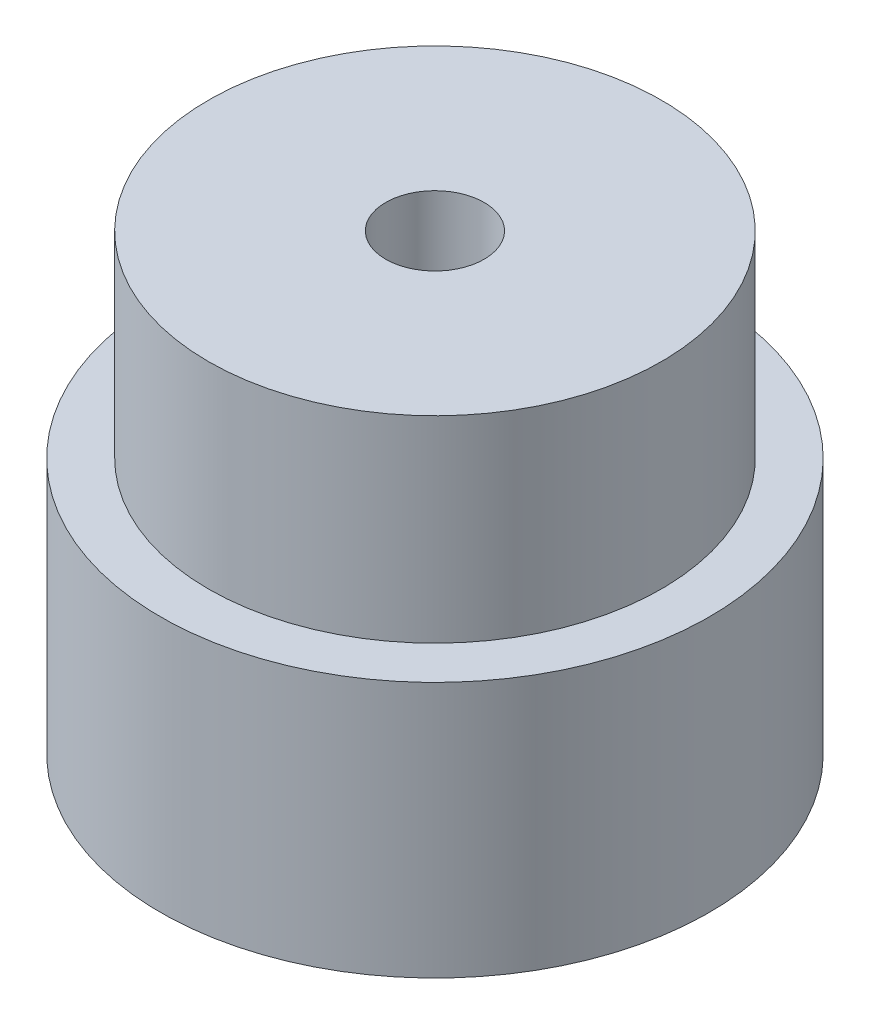
ISO-10303-21;
HEADER;
FILE_DESCRIPTION(('STEP AP214'),'2;1');
FILE_NAME('part.step','',(''),(''),'','','');
FILE_SCHEMA(('AUTOMOTIVE_DESIGN { 1 0 10303 214 1 1 1 1 }'));
ENDSEC;
DATA;
#1=APPLICATION_CONTEXT('core data for automotive mechanical design processes');
#2=APPLICATION_PROTOCOL_DEFINITION('international standard','automotive_design',2000,#1);
#3=PRODUCT_CONTEXT('',#1,'mechanical');
#4=PRODUCT('Part','Part','',(#3));
#5=PRODUCT_RELATED_PRODUCT_CATEGORY('part','',(#4));
#6=PRODUCT_DEFINITION_FORMATION('','',#4);
#7=PRODUCT_DEFINITION_CONTEXT('part definition',#1,'design');
#8=PRODUCT_DEFINITION('design','',#6,#7);
#9=PRODUCT_DEFINITION_SHAPE('','',#8);
#10=(LENGTH_UNIT() NAMED_UNIT(*) SI_UNIT(.MILLI.,.METRE.));
#11=(NAMED_UNIT(*) PLANE_ANGLE_UNIT() SI_UNIT($,.RADIAN.));
#12=(NAMED_UNIT(*) SI_UNIT($,.STERADIAN.) SOLID_ANGLE_UNIT());
#13=UNCERTAINTY_MEASURE_WITH_UNIT(LENGTH_MEASURE(1.E-05),#10,'distance_accuracy_value','');
#14=(GEOMETRIC_REPRESENTATION_CONTEXT(3) GLOBAL_UNCERTAINTY_ASSIGNED_CONTEXT((#13)) GLOBAL_UNIT_ASSIGNED_CONTEXT((#10,
#11,#12)) REPRESENTATION_CONTEXT('',''));
#15=CARTESIAN_POINT('',(0.,0.,0.));
#16=DIRECTION('',(0.,0.,1.));
#17=DIRECTION('',(1.,0.,0.));
#18=AXIS2_PLACEMENT_3D('',#15,#16,#17);
#19=CARTESIAN_POINT('',(0.,13.,0.));
#20=DIRECTION('',(0.,-1.,0.));
#21=DIRECTION('',(0.,0.,-1.));
#22=AXIS2_PLACEMENT_3D('',#19,#20,#21);
#23=CYLINDRICAL_SURFACE('',#22,13.94);
#24=CARTESIAN_POINT('',(0.,13.,0.));
#25=DIRECTION('',(0.,1.,0.));
#26=DIRECTION('',(0.,0.,1.));
#27=AXIS2_PLACEMENT_3D('',#24,#25,#26);
#28=CIRCLE('',#27,13.94);
#29=CARTESIAN_POINT('',(0.,13.,-13.94));
#30=VERTEX_POINT('',#29);
#31=EDGE_CURVE('E44',#30,#30,#28,.T.);
#32=CARTESIAN_POINT('',(0.,0.,0.));
#33=DIRECTION('',(0.,1.,0.));
#34=DIRECTION('',(0.,0.,1.));
#35=AXIS2_PLACEMENT_3D('',#32,#33,#34);
#36=CIRCLE('',#35,13.94);
#37=CARTESIAN_POINT('',(0.,0.,-13.94));
#38=VERTEX_POINT('',#37);
#39=EDGE_CURVE('E40',#38,#38,#36,.T.);
#40=CARTESIAN_POINT('',(0.,13.,-13.94));
#41=CARTESIAN_POINT('',(0.,12.8645833333333,-13.94));
#42=CARTESIAN_POINT('',(0.,12.7291666666667,-13.94));
#43=CARTESIAN_POINT('',(0.,12.4583333333333,-13.94));
#44=CARTESIAN_POINT('',(0.,12.3229166666667,-13.94));
#45=CARTESIAN_POINT('',(0.,12.0520833333333,-13.94));
#46=CARTESIAN_POINT('',(0.,11.9166666666667,-13.94));
#47=CARTESIAN_POINT('',(0.,11.6458333333333,-13.94));
#48=CARTESIAN_POINT('',(0.,11.5104166666667,-13.94));
#49=CARTESIAN_POINT('',(0.,11.2395833333333,-13.94));
#50=CARTESIAN_POINT('',(0.,11.1041666666667,-13.94));
#51=CARTESIAN_POINT('',(0.,10.8333333333333,-13.94));
#52=CARTESIAN_POINT('',(0.,10.6979166666667,-13.94));
#53=CARTESIAN_POINT('',(0.,10.4270833333333,-13.94));
#54=CARTESIAN_POINT('',(0.,10.2916666666667,-13.94));
#55=CARTESIAN_POINT('',(0.,10.0208333333333,-13.94));
#56=CARTESIAN_POINT('',(0.,9.88541666666667,-13.94));
#57=CARTESIAN_POINT('',(0.,9.61458333333333,-13.94));
#58=CARTESIAN_POINT('',(0.,9.47916666666667,-13.94));
#59=CARTESIAN_POINT('',(0.,9.20833333333333,-13.94));
#60=CARTESIAN_POINT('',(0.,9.07291666666666,-13.94));
#61=CARTESIAN_POINT('',(0.,8.80208333333333,-13.94));
#62=CARTESIAN_POINT('',(0.,8.66666666666667,-13.94));
#63=CARTESIAN_POINT('',(0.,8.39583333333333,-13.94));
#64=CARTESIAN_POINT('',(0.,8.26041666666667,-13.94));
#65=CARTESIAN_POINT('',(0.,7.98958333333333,-13.94));
#66=CARTESIAN_POINT('',(0.,7.85416666666667,-13.94));
#67=CARTESIAN_POINT('',(0.,7.58333333333333,-13.94));
#68=CARTESIAN_POINT('',(0.,7.44791666666667,-13.94));
#69=CARTESIAN_POINT('',(0.,7.17708333333333,-13.94));
#70=CARTESIAN_POINT('',(0.,7.04166666666667,-13.94));
#71=CARTESIAN_POINT('',(0.,6.77083333333333,-13.94));
#72=CARTESIAN_POINT('',(0.,6.63541666666667,-13.94));
#73=CARTESIAN_POINT('',(0.,6.36458333333333,-13.94));
#74=CARTESIAN_POINT('',(0.,6.22916666666667,-13.94));
#75=CARTESIAN_POINT('',(0.,5.95833333333333,-13.94));
#76=CARTESIAN_POINT('',(0.,5.82291666666667,-13.94));
#77=CARTESIAN_POINT('',(0.,5.55208333333333,-13.94));
#78=CARTESIAN_POINT('',(0.,5.41666666666667,-13.94));
#79=CARTESIAN_POINT('',(0.,5.14583333333333,-13.94));
#80=CARTESIAN_POINT('',(0.,5.01041666666667,-13.94));
#81=CARTESIAN_POINT('',(0.,4.73958333333333,-13.94));
#82=CARTESIAN_POINT('',(0.,4.60416666666667,-13.94));
#83=CARTESIAN_POINT('',(0.,4.33333333333333,-13.94));
#84=CARTESIAN_POINT('',(0.,4.19791666666667,-13.94));
#85=CARTESIAN_POINT('',(0.,3.92708333333333,-13.94));
#86=CARTESIAN_POINT('',(0.,3.79166666666667,-13.94));
#87=CARTESIAN_POINT('',(0.,3.52083333333333,-13.94));
#88=CARTESIAN_POINT('',(0.,3.38541666666667,-13.94));
#89=CARTESIAN_POINT('',(0.,3.11458333333333,-13.94));
#90=CARTESIAN_POINT('',(0.,2.97916666666667,-13.94));
#91=CARTESIAN_POINT('',(0.,2.70833333333333,-13.94));
#92=CARTESIAN_POINT('',(0.,2.57291666666667,-13.94));
#93=CARTESIAN_POINT('',(0.,2.30208333333333,-13.94));
#94=CARTESIAN_POINT('',(0.,2.16666666666667,-13.94));
#95=CARTESIAN_POINT('',(0.,1.89583333333333,-13.94));
#96=CARTESIAN_POINT('',(0.,1.76041666666667,-13.94));
#97=CARTESIAN_POINT('',(0.,1.48958333333333,-13.94));
#98=CARTESIAN_POINT('',(0.,1.35416666666667,-13.94));
#99=CARTESIAN_POINT('',(0.,1.08333333333333,-13.94));
#100=CARTESIAN_POINT('',(0.,0.947916666666667,-13.94));
#101=CARTESIAN_POINT('',(0.,0.677083333333334,-13.94));
#102=CARTESIAN_POINT('',(0.,0.541666666666667,-13.94));
#103=CARTESIAN_POINT('',(0.,0.270833333333334,-13.94));
#104=CARTESIAN_POINT('',(0.,0.135416666666667,-13.94));
#105=CARTESIAN_POINT('',(0.,0.,-13.94));
#106=B_SPLINE_CURVE_WITH_KNOTS('',3,(#40,#41,#42,#43,#44,#45,#46,#47,#48,#49,#50,#51,#52,#53,
#54,#55,#56,#57,#58,#59,#60,#61,#62,#63,#64,#65,#66,#67,#68,#69,#70,#71,#72,#73,#74,#75,#76,#77,
#78,#79,#80,#81,#82,#83,#84,#85,#86,#87,#88,#89,#90,#91,#92,#93,#94,#95,#96,#97,#98,#99,#100,
#101,#102,#103,#104,#105),.UNSPECIFIED.,.F.,.F.,(4,2,2,2,2,2,2,2,2,2,2,2,2,2,2,2,2,2,2,2,2,2,2,
2,2,2,2,2,2,2,2,2,4),(0.,0.40625,0.812500000000001,1.21875,1.625,2.03125,2.4375,2.84375,3.25,
3.65625,4.0625,4.46875,4.875,5.28125,5.6875,6.09375,6.5,6.90625,7.3125,7.71875,8.125,8.53125,
8.9375,9.34375,9.75,10.15625,10.5625,10.96875,11.375,11.78125,12.1875,12.59375,13.),.UNSPECIFIED.);
#107=EDGE_CURVE('BSEAM37',#30,#38,#106,.T.);
#108=ORIENTED_EDGE('',*,*,#31,.F.);
#109=ORIENTED_EDGE('',*,*,#39,.T.);
#110=ORIENTED_EDGE('',*,*,#107,.T.);
#111=ORIENTED_EDGE('',*,*,#107,.F.);
#112=EDGE_LOOP('',(#108,#110,#109,#111));
#113=FACE_BOUND('',#112,.T.);
#114=ADVANCED_FACE('F37',(#113),#23,.T.);
#115=CARTESIAN_POINT('',(0.,13.,0.));
#116=DIRECTION('',(0.,1.,0.));
#117=DIRECTION('',(0.,0.,1.));
#118=AXIS2_PLACEMENT_3D('',#115,#116,#117);
#119=PLANE('',#118);
#120=CARTESIAN_POINT('',(0.,13.,0.));
#121=DIRECTION('',(0.,1.,0.));
#122=DIRECTION('',(0.,0.,1.));
#123=AXIS2_PLACEMENT_3D('',#120,#121,#122);
#124=CIRCLE('',#123,11.5);
#125=CARTESIAN_POINT('',(0.,13.,11.5));
#126=VERTEX_POINT('',#125);
#127=EDGE_CURVE('E10',#126,#126,#124,.T.);
#128=ORIENTED_EDGE('',*,*,#127,.F.);
#129=EDGE_LOOP('',(#128));
#130=FACE_BOUND('',#129,.T.);
#131=ORIENTED_EDGE('',*,*,#31,.T.);
#132=EDGE_LOOP('',(#131));
#133=FACE_BOUND('',#132,.T.);
#134=ADVANCED_FACE('F76',(#130,#133),#119,.T.);
#135=CARTESIAN_POINT('',(0.,0.,0.));
#136=DIRECTION('',(0.,1.,0.));
#137=DIRECTION('',(0.,0.,1.));
#138=AXIS2_PLACEMENT_3D('',#135,#136,#137);
#139=PLANE('',#138);
#140=CARTESIAN_POINT('',(0.,0.,0.));
#141=DIRECTION('',(0.,1.,0.));
#142=DIRECTION('',(0.,0.,1.));
#143=AXIS2_PLACEMENT_3D('',#140,#141,#142);
#144=CIRCLE('',#143,2.5);
#145=CARTESIAN_POINT('',(0.,0.,2.5));
#146=VERTEX_POINT('',#145);
#147=EDGE_CURVE('E53',#146,#146,#144,.T.);
#148=ORIENTED_EDGE('',*,*,#147,.T.);
#149=EDGE_LOOP('',(#148));
#150=FACE_BOUND('',#149,.T.);
#151=ORIENTED_EDGE('',*,*,#39,.F.);
#152=EDGE_LOOP('',(#151));
#153=FACE_BOUND('',#152,.T.);
#154=ADVANCED_FACE('F71',(#150,#153),#139,.F.);
#155=CARTESIAN_POINT('',(0.,23.,0.));
#156=DIRECTION('',(0.,-1.,0.));
#157=DIRECTION('',(0.,0.,-1.));
#158=AXIS2_PLACEMENT_3D('',#155,#156,#157);
#159=CYLINDRICAL_SURFACE('',#158,11.5);
#160=CARTESIAN_POINT('',(0.,23.,0.));
#161=DIRECTION('',(0.,1.,0.));
#162=DIRECTION('',(0.,0.,1.));
#163=AXIS2_PLACEMENT_3D('',#160,#161,#162);
#164=CIRCLE('',#163,11.5);
#165=CARTESIAN_POINT('',(0.,23.,11.5));
#166=VERTEX_POINT('',#165);
#167=EDGE_CURVE('E50',#166,#166,#164,.T.);
#168=ORIENTED_EDGE('',*,*,#167,.F.);
#169=EDGE_LOOP('',(#168));
#170=FACE_BOUND('',#169,.T.);
#171=ORIENTED_EDGE('',*,*,#127,.T.);
#172=EDGE_LOOP('',(#171));
#173=FACE_BOUND('',#172,.T.);
#174=ADVANCED_FACE('F66',(#170,#173),#159,.T.);
#175=CARTESIAN_POINT('',(0.,23.,0.));
#176=DIRECTION('',(0.,1.,0.));
#177=DIRECTION('',(0.,0.,1.));
#178=AXIS2_PLACEMENT_3D('',#175,#176,#177);
#179=PLANE('',#178);
#180=CARTESIAN_POINT('',(0.,23.,0.));
#181=DIRECTION('',(0.,1.,0.));
#182=DIRECTION('',(0.,0.,1.));
#183=AXIS2_PLACEMENT_3D('',#180,#181,#182);
#184=CIRCLE('',#183,2.5);
#185=CARTESIAN_POINT('',(0.,23.,2.5));
#186=VERTEX_POINT('',#185);
#187=EDGE_CURVE('E56',#186,#186,#184,.T.);
#188=ORIENTED_EDGE('',*,*,#187,.F.);
#189=EDGE_LOOP('',(#188));
#190=FACE_BOUND('',#189,.T.);
#191=ORIENTED_EDGE('',*,*,#167,.T.);
#192=EDGE_LOOP('',(#191));
#193=FACE_BOUND('',#192,.T.);
#194=ADVANCED_FACE('F63',(#190,#193),#179,.T.);
#195=CARTESIAN_POINT('',(0.,-7.,0.));
#196=DIRECTION('',(0.,1.,0.));
#197=DIRECTION('',(0.,0.,1.));
#198=AXIS2_PLACEMENT_3D('',#195,#196,#197);
#199=CYLINDRICAL_SURFACE('',#198,2.5);
#200=ORIENTED_EDGE('',*,*,#187,.T.);
#201=EDGE_LOOP('',(#200));
#202=FACE_BOUND('',#201,.T.);
#203=ORIENTED_EDGE('',*,*,#147,.F.);
#204=EDGE_LOOP('',(#203));
#205=FACE_BOUND('',#204,.T.);
#206=ADVANCED_FACE('F60',(#202,#205),#199,.F.);
#207=CLOSED_SHELL('',(#114,#134,#154,#174,#194,#206));
#208=MANIFOLD_SOLID_BREP('B2',#207);
#209=ADVANCED_BREP_SHAPE_REPRESENTATION('',(#18,#208),#14);
#210=SHAPE_DEFINITION_REPRESENTATION(#9,#209);
ENDSEC;
END-ISO-10303-21;
